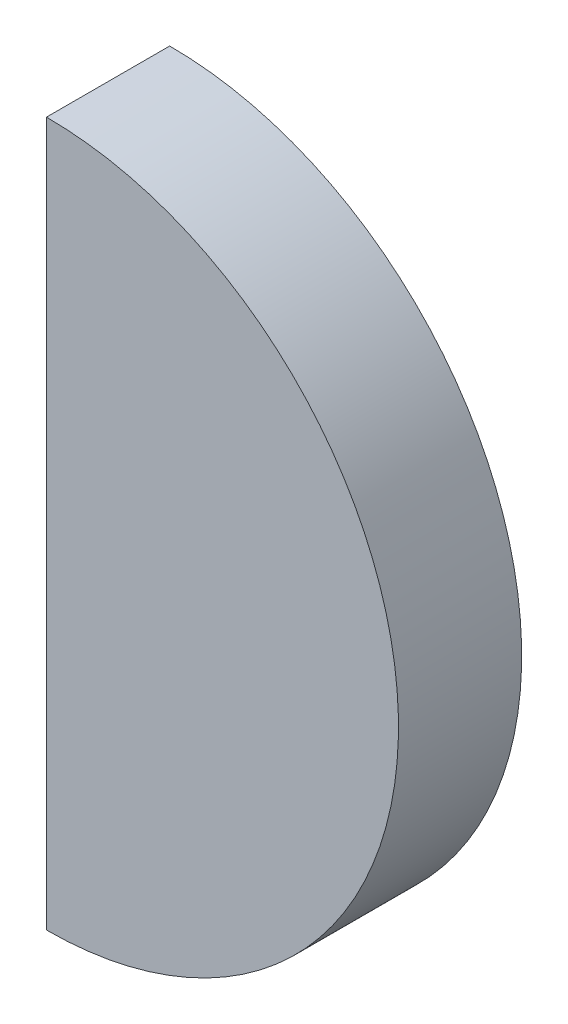
ISO-10303-21;
HEADER;
FILE_DESCRIPTION(('STEP AP214'),'2;1');
FILE_NAME('part.step','',(''),(''),'','','');
FILE_SCHEMA(('AUTOMOTIVE_DESIGN { 1 0 10303 214 1 1 1 1 }'));
ENDSEC;
DATA;
#1=APPLICATION_CONTEXT('core data for automotive mechanical design processes');
#2=APPLICATION_PROTOCOL_DEFINITION('international standard','automotive_design',2000,#1);
#3=PRODUCT_CONTEXT('',#1,'mechanical');
#4=PRODUCT('Part','Part','',(#3));
#5=PRODUCT_RELATED_PRODUCT_CATEGORY('part','',(#4));
#6=PRODUCT_DEFINITION_FORMATION('','',#4);
#7=PRODUCT_DEFINITION_CONTEXT('part definition',#1,'design');
#8=PRODUCT_DEFINITION('design','',#6,#7);
#9=PRODUCT_DEFINITION_SHAPE('','',#8);
#10=(LENGTH_UNIT() NAMED_UNIT(*) SI_UNIT(.MILLI.,.METRE.));
#11=(NAMED_UNIT(*) PLANE_ANGLE_UNIT() SI_UNIT($,.RADIAN.));
#12=(NAMED_UNIT(*) SI_UNIT($,.STERADIAN.) SOLID_ANGLE_UNIT());
#13=UNCERTAINTY_MEASURE_WITH_UNIT(LENGTH_MEASURE(1.E-05),#10,'distance_accuracy_value','');
#14=(GEOMETRIC_REPRESENTATION_CONTEXT(3) GLOBAL_UNCERTAINTY_ASSIGNED_CONTEXT((#13)) GLOBAL_UNIT_ASSIGNED_CONTEXT((#10,
#11,#12)) REPRESENTATION_CONTEXT('',''));
#15=CARTESIAN_POINT('',(0.,0.,0.));
#16=DIRECTION('',(0.,0.,1.));
#17=DIRECTION('',(1.,0.,0.));
#18=AXIS2_PLACEMENT_3D('',#15,#16,#17);
#19=CARTESIAN_POINT('',(0.,0.,70.));
#20=DIRECTION('',(1.,0.,0.));
#21=DIRECTION('',(0.,1.,0.));
#22=AXIS2_PLACEMENT_3D('',#19,#20,#21);
#23=PLANE('',#22);
#24=DIRECTION('',(0.,-1.,0.));
#25=VECTOR('',#24,1.);
#26=CARTESIAN_POINT('',(0.,0.,0.));
#27=LINE('',#26,#25);
#28=CARTESIAN_POINT('',(0.,200.,0.));
#29=VERTEX_POINT('',#28);
#30=CARTESIAN_POINT('',(0.,-200.,0.));
#31=VERTEX_POINT('',#30);
#32=EDGE_CURVE('E66',#29,#31,#27,.T.);
#33=ORIENTED_EDGE('',*,*,#32,.T.);
#34=DIRECTION('',(0.,0.,-1.));
#35=VECTOR('',#34,1.);
#36=CARTESIAN_POINT('',(0.,-200.,70.));
#37=LINE('',#36,#35);
#38=CARTESIAN_POINT('',(0.,-200.,70.));
#39=VERTEX_POINT('',#38);
#40=EDGE_CURVE('E11',#39,#31,#37,.T.);
#41=ORIENTED_EDGE('',*,*,#40,.F.);
#42=DIRECTION('',(0.,-1.,0.));
#43=VECTOR('',#42,1.);
#44=CARTESIAN_POINT('',(0.,0.,70.));
#45=LINE('',#44,#43);
#46=CARTESIAN_POINT('',(0.,200.,70.));
#47=VERTEX_POINT('',#46);
#48=EDGE_CURVE('E65',#47,#39,#45,.T.);
#49=ORIENTED_EDGE('',*,*,#48,.F.);
#50=DIRECTION('',(0.,0.,-1.));
#51=VECTOR('',#50,1.);
#52=CARTESIAN_POINT('',(0.,200.,70.));
#53=LINE('',#52,#51);
#54=EDGE_CURVE('E43',#47,#29,#53,.T.);
#55=ORIENTED_EDGE('',*,*,#54,.T.);
#56=EDGE_LOOP('',(#33,#41,#49,#55));
#57=FACE_BOUND('',#56,.T.);
#58=ADVANCED_FACE('F35',(#57),#23,.F.);
#59=CARTESIAN_POINT('',(0.,0.,70.));
#60=DIRECTION('',(0.,0.,-1.));
#61=DIRECTION('',(-1.,0.,0.));
#62=AXIS2_PLACEMENT_3D('',#59,#60,#61);
#63=CYLINDRICAL_SURFACE('',#62,200.);
#64=CARTESIAN_POINT('',(0.,0.,0.));
#65=DIRECTION('',(0.,0.,1.));
#66=DIRECTION('',(1.,0.,0.));
#67=AXIS2_PLACEMENT_3D('',#64,#65,#66);
#68=CIRCLE('',#67,200.);
#69=EDGE_CURVE('E58',#31,#29,#68,.T.);
#70=ORIENTED_EDGE('',*,*,#69,.T.);
#71=ORIENTED_EDGE('',*,*,#54,.F.);
#72=CARTESIAN_POINT('',(0.,0.,70.));
#73=DIRECTION('',(0.,0.,1.));
#74=DIRECTION('',(1.,0.,0.));
#75=AXIS2_PLACEMENT_3D('',#72,#73,#74);
#76=CIRCLE('',#75,200.);
#77=EDGE_CURVE('E50',#39,#47,#76,.T.);
#78=ORIENTED_EDGE('',*,*,#77,.F.);
#79=ORIENTED_EDGE('',*,*,#40,.T.);
#80=EDGE_LOOP('',(#70,#71,#78,#79));
#81=FACE_BOUND('',#80,.T.);
#82=ADVANCED_FACE('F61',(#81),#63,.T.);
#83=CARTESIAN_POINT('',(0.,0.,70.));
#84=DIRECTION('',(0.,0.,1.));
#85=DIRECTION('',(1.,0.,0.));
#86=AXIS2_PLACEMENT_3D('',#83,#84,#85);
#87=PLANE('',#86);
#88=ORIENTED_EDGE('',*,*,#48,.T.);
#89=ORIENTED_EDGE('',*,*,#77,.T.);
#90=EDGE_LOOP('',(#88,#89));
#91=FACE_BOUND('',#90,.T.);
#92=ADVANCED_FACE('F73',(#91),#87,.T.);
#93=CARTESIAN_POINT('',(0.,0.,0.));
#94=DIRECTION('',(0.,0.,1.));
#95=DIRECTION('',(1.,0.,0.));
#96=AXIS2_PLACEMENT_3D('',#93,#94,#95);
#97=PLANE('',#96);
#98=ORIENTED_EDGE('',*,*,#32,.F.);
#99=ORIENTED_EDGE('',*,*,#69,.F.);
#100=EDGE_LOOP('',(#98,#99));
#101=FACE_BOUND('',#100,.T.);
#102=ADVANCED_FACE('F69',(#101),#97,.F.);
#103=CLOSED_SHELL('',(#58,#82,#92,#102));
#104=MANIFOLD_SOLID_BREP('B2',#103);
#105=ADVANCED_BREP_SHAPE_REPRESENTATION('',(#18,#104),#14);
#106=SHAPE_DEFINITION_REPRESENTATION(#9,#105);
ENDSEC;
END-ISO-10303-21;
